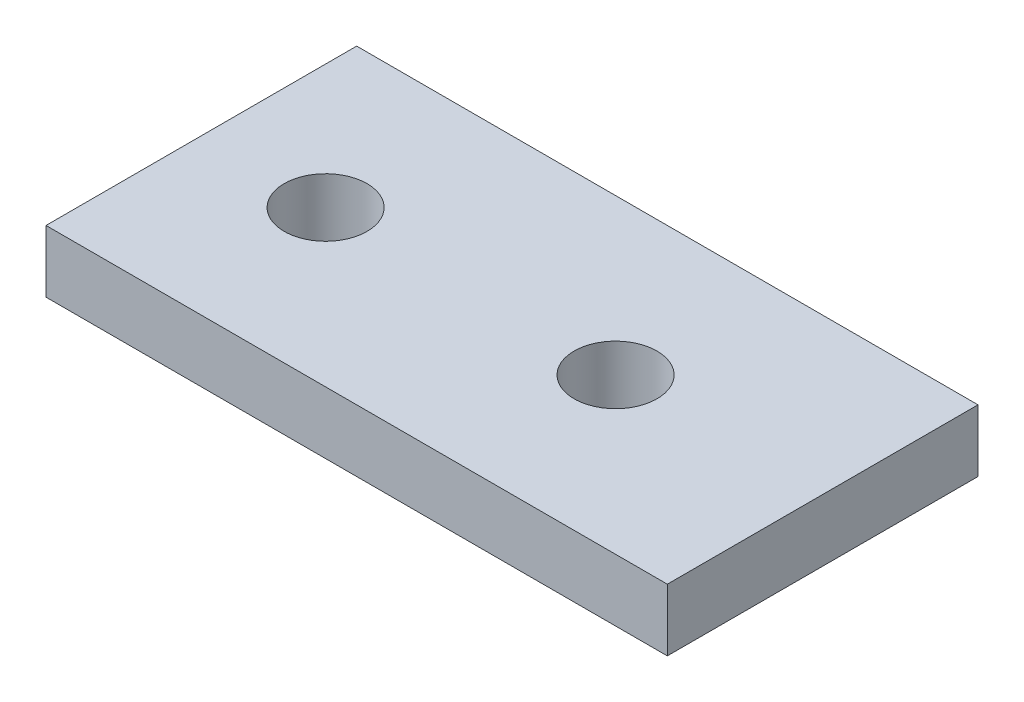
ISO-10303-21;
HEADER;
FILE_DESCRIPTION(('STEP AP214'),'2;1');
FILE_NAME('part.step','',(''),(''),'','','');
FILE_SCHEMA(('AUTOMOTIVE_DESIGN { 1 0 10303 214 1 1 1 1 }'));
ENDSEC;
DATA;
#1=APPLICATION_CONTEXT('core data for automotive mechanical design processes');
#2=APPLICATION_PROTOCOL_DEFINITION('international standard','automotive_design',2000,#1);
#3=PRODUCT_CONTEXT('',#1,'mechanical');
#4=PRODUCT('Part','Part','',(#3));
#5=PRODUCT_RELATED_PRODUCT_CATEGORY('part','',(#4));
#6=PRODUCT_DEFINITION_FORMATION('','',#4);
#7=PRODUCT_DEFINITION_CONTEXT('part definition',#1,'design');
#8=PRODUCT_DEFINITION('design','',#6,#7);
#9=PRODUCT_DEFINITION_SHAPE('','',#8);
#10=(LENGTH_UNIT() NAMED_UNIT(*) SI_UNIT(.MILLI.,.METRE.));
#11=(NAMED_UNIT(*) PLANE_ANGLE_UNIT() SI_UNIT($,.RADIAN.));
#12=(NAMED_UNIT(*) SI_UNIT($,.STERADIAN.) SOLID_ANGLE_UNIT());
#13=UNCERTAINTY_MEASURE_WITH_UNIT(LENGTH_MEASURE(1.E-05),#10,'distance_accuracy_value','');
#14=(GEOMETRIC_REPRESENTATION_CONTEXT(3) GLOBAL_UNCERTAINTY_ASSIGNED_CONTEXT((#13)) GLOBAL_UNIT_ASSIGNED_CONTEXT((#10,
#11,#12)) REPRESENTATION_CONTEXT('',''));
#15=CARTESIAN_POINT('',(0.,0.,0.));
#16=DIRECTION('',(0.,0.,1.));
#17=DIRECTION('',(1.,0.,0.));
#18=AXIS2_PLACEMENT_3D('',#15,#16,#17);
#19=CARTESIAN_POINT('',(-30.,5.99999999999991,-15.));
#20=DIRECTION('',(0.,1.,0.));
#21=DIRECTION('',(0.,0.,-1.));
#22=AXIS2_PLACEMENT_3D('',#19,#20,#21);
#23=PLANE('',#22);
#24=CARTESIAN_POINT('',(10.,6.00000000000009,0.));
#25=DIRECTION('',(0.,-1.,0.));
#26=DIRECTION('',(0.,0.,-1.));
#27=AXIS2_PLACEMENT_3D('',#24,#25,#26);
#28=CIRCLE('',#27,4.);
#29=CARTESIAN_POINT('',(10.,6.00000000000009,-4.));
#30=VERTEX_POINT('',#29);
#31=EDGE_CURVE('E103',#30,#30,#28,.T.);
#32=ORIENTED_EDGE('',*,*,#31,.T.);
#33=EDGE_LOOP('',(#32));
#34=FACE_BOUND('',#33,.T.);
#35=DIRECTION('',(0.,0.,-1.));
#36=VECTOR('',#35,1.);
#37=CARTESIAN_POINT('',(-30.,5.99999999999991,15.));
#38=LINE('',#37,#36);
#39=CARTESIAN_POINT('',(-30.,5.99999999999991,15.));
#40=VERTEX_POINT('',#39);
#41=CARTESIAN_POINT('',(-30.,5.99999999999991,-15.));
#42=VERTEX_POINT('',#41);
#43=EDGE_CURVE('E91',#40,#42,#38,.T.);
#44=ORIENTED_EDGE('',*,*,#43,.F.);
#45=DIRECTION('',(-1.,0.,0.));
#46=VECTOR('',#45,1.);
#47=CARTESIAN_POINT('',(-30.,5.99999999999991,15.));
#48=LINE('',#47,#46);
#49=CARTESIAN_POINT('',(30.,6.00000000000015,15.));
#50=VERTEX_POINT('',#49);
#51=EDGE_CURVE('E94',#50,#40,#48,.T.);
#52=ORIENTED_EDGE('',*,*,#51,.F.);
#53=DIRECTION('',(0.,0.,1.));
#54=VECTOR('',#53,1.);
#55=CARTESIAN_POINT('',(30.,6.00000000000015,15.));
#56=LINE('',#55,#54);
#57=CARTESIAN_POINT('',(30.,6.00000000000015,-15.));
#58=VERTEX_POINT('',#57);
#59=EDGE_CURVE('E82',#58,#50,#56,.T.);
#60=ORIENTED_EDGE('',*,*,#59,.F.);
#61=DIRECTION('',(1.,0.,0.));
#62=VECTOR('',#61,1.);
#63=CARTESIAN_POINT('',(-30.,5.99999999999991,-15.));
#64=LINE('',#63,#62);
#65=EDGE_CURVE('E87',#42,#58,#64,.T.);
#66=ORIENTED_EDGE('',*,*,#65,.F.);
#67=EDGE_LOOP('',(#44,#52,#60,#66));
#68=FACE_BOUND('',#67,.T.);
#69=CARTESIAN_POINT('',(-18.,5.99999999999994,0.));
#70=DIRECTION('',(0.,-1.,0.));
#71=DIRECTION('',(0.,0.,-1.));
#72=AXIS2_PLACEMENT_3D('',#69,#70,#71);
#73=CIRCLE('',#72,4.);
#74=CARTESIAN_POINT('',(-18.,5.99999999999994,-4.));
#75=VERTEX_POINT('',#74);
#76=EDGE_CURVE('E114',#75,#75,#73,.T.);
#77=ORIENTED_EDGE('',*,*,#76,.T.);
#78=EDGE_LOOP('',(#77));
#79=FACE_BOUND('',#78,.T.);
#80=ADVANCED_FACE('F35',(#34,#68,#79),#23,.T.);
#81=CARTESIAN_POINT('',(-30.,0.,-15.));
#82=DIRECTION('',(0.,1.,0.));
#83=DIRECTION('',(0.,0.,-1.));
#84=AXIS2_PLACEMENT_3D('',#81,#82,#83);
#85=PLANE('',#84);
#86=CARTESIAN_POINT('',(10.,0.,0.));
#87=DIRECTION('',(0.,-1.,0.));
#88=DIRECTION('',(0.,0.,-1.));
#89=AXIS2_PLACEMENT_3D('',#86,#87,#88);
#90=CIRCLE('',#89,4.);
#91=CARTESIAN_POINT('',(10.,0.,-4.));
#92=VERTEX_POINT('',#91);
#93=EDGE_CURVE('E111',#92,#92,#90,.T.);
#94=ORIENTED_EDGE('',*,*,#93,.F.);
#95=EDGE_LOOP('',(#94));
#96=FACE_BOUND('',#95,.T.);
#97=DIRECTION('',(0.,0.,-1.));
#98=VECTOR('',#97,1.);
#99=CARTESIAN_POINT('',(-30.,0.,15.));
#100=LINE('',#99,#98);
#101=CARTESIAN_POINT('',(-30.,0.,15.));
#102=VERTEX_POINT('',#101);
#103=CARTESIAN_POINT('',(-30.,0.,-15.));
#104=VERTEX_POINT('',#103);
#105=EDGE_CURVE('E99',#102,#104,#100,.T.);
#106=ORIENTED_EDGE('',*,*,#105,.T.);
#107=DIRECTION('',(1.,0.,0.));
#108=VECTOR('',#107,1.);
#109=CARTESIAN_POINT('',(-30.,0.,-15.));
#110=LINE('',#109,#108);
#111=CARTESIAN_POINT('',(30.,1.49186218934005E-13,-15.));
#112=VERTEX_POINT('',#111);
#113=EDGE_CURVE('E102',#104,#112,#110,.T.);
#114=ORIENTED_EDGE('',*,*,#113,.T.);
#115=DIRECTION('',(0.,0.,1.));
#116=VECTOR('',#115,1.);
#117=CARTESIAN_POINT('',(30.,1.49186218934005E-13,15.));
#118=LINE('',#117,#116);
#119=CARTESIAN_POINT('',(30.,1.49186218934005E-13,15.));
#120=VERTEX_POINT('',#119);
#121=EDGE_CURVE('E85',#112,#120,#118,.T.);
#122=ORIENTED_EDGE('',*,*,#121,.T.);
#123=DIRECTION('',(-1.,0.,0.));
#124=VECTOR('',#123,1.);
#125=CARTESIAN_POINT('',(-30.,0.,15.));
#126=LINE('',#125,#124);
#127=EDGE_CURVE('E106',#120,#102,#126,.T.);
#128=ORIENTED_EDGE('',*,*,#127,.T.);
#129=EDGE_LOOP('',(#106,#114,#122,#128));
#130=FACE_BOUND('',#129,.T.);
#131=CARTESIAN_POINT('',(-18.,0.,0.));
#132=DIRECTION('',(0.,-1.,0.));
#133=DIRECTION('',(0.,0.,-1.));
#134=AXIS2_PLACEMENT_3D('',#131,#132,#133);
#135=CIRCLE('',#134,4.);
#136=CARTESIAN_POINT('',(-18.,0.,-4.));
#137=VERTEX_POINT('',#136);
#138=EDGE_CURVE('E117',#137,#137,#135,.T.);
#139=ORIENTED_EDGE('',*,*,#138,.F.);
#140=EDGE_LOOP('',(#139));
#141=FACE_BOUND('',#140,.T.);
#142=ADVANCED_FACE('F130',(#96,#130,#141),#85,.F.);
#143=CARTESIAN_POINT('',(-30.,5.99999999999991,15.));
#144=DIRECTION('',(1.,0.,0.));
#145=DIRECTION('',(0.,0.,1.));
#146=AXIS2_PLACEMENT_3D('',#143,#144,#145);
#147=PLANE('',#146);
#148=ORIENTED_EDGE('',*,*,#105,.F.);
#149=DIRECTION('',(0.,-1.,0.));
#150=VECTOR('',#149,1.);
#151=CARTESIAN_POINT('',(-30.,5.99999999999991,15.));
#152=LINE('',#151,#150);
#153=EDGE_CURVE('E52',#40,#102,#152,.T.);
#154=ORIENTED_EDGE('',*,*,#153,.F.);
#155=ORIENTED_EDGE('',*,*,#43,.T.);
#156=DIRECTION('',(0.,-1.,0.));
#157=VECTOR('',#156,1.);
#158=CARTESIAN_POINT('',(-30.,5.99999999999991,-15.));
#159=LINE('',#158,#157);
#160=EDGE_CURVE('E11',#42,#104,#159,.T.);
#161=ORIENTED_EDGE('',*,*,#160,.T.);
#162=EDGE_LOOP('',(#148,#154,#155,#161));
#163=FACE_BOUND('',#162,.T.);
#164=ADVANCED_FACE('F37',(#163),#147,.F.);
#165=CARTESIAN_POINT('',(-30.,5.99999999999991,-15.));
#166=DIRECTION('',(0.,0.,1.));
#167=DIRECTION('',(-1.,0.,0.));
#168=AXIS2_PLACEMENT_3D('',#165,#166,#167);
#169=PLANE('',#168);
#170=ORIENTED_EDGE('',*,*,#113,.F.);
#171=ORIENTED_EDGE('',*,*,#160,.F.);
#172=ORIENTED_EDGE('',*,*,#65,.T.);
#173=DIRECTION('',(0.,-1.,0.));
#174=VECTOR('',#173,1.);
#175=CARTESIAN_POINT('',(30.,6.00000000000015,-15.));
#176=LINE('',#175,#174);
#177=EDGE_CURVE('E44',#58,#112,#176,.T.);
#178=ORIENTED_EDGE('',*,*,#177,.T.);
#179=EDGE_LOOP('',(#170,#171,#172,#178));
#180=FACE_BOUND('',#179,.T.);
#181=ADVANCED_FACE('F88',(#180),#169,.F.);
#182=CARTESIAN_POINT('',(30.,6.00000000000015,15.));
#183=DIRECTION('',(-1.,0.,0.));
#184=DIRECTION('',(0.,0.,-1.));
#185=AXIS2_PLACEMENT_3D('',#182,#183,#184);
#186=PLANE('',#185);
#187=ORIENTED_EDGE('',*,*,#121,.F.);
#188=ORIENTED_EDGE('',*,*,#177,.F.);
#189=ORIENTED_EDGE('',*,*,#59,.T.);
#190=DIRECTION('',(0.,-1.,0.));
#191=VECTOR('',#190,1.);
#192=CARTESIAN_POINT('',(30.,6.00000000000015,15.));
#193=LINE('',#192,#191);
#194=EDGE_CURVE('E68',#50,#120,#193,.T.);
#195=ORIENTED_EDGE('',*,*,#194,.T.);
#196=EDGE_LOOP('',(#187,#188,#189,#195));
#197=FACE_BOUND('',#196,.T.);
#198=ADVANCED_FACE('F80',(#197),#186,.F.);
#199=CARTESIAN_POINT('',(-30.,5.99999999999991,15.));
#200=DIRECTION('',(0.,0.,-1.));
#201=DIRECTION('',(1.,0.,0.));
#202=AXIS2_PLACEMENT_3D('',#199,#200,#201);
#203=PLANE('',#202);
#204=ORIENTED_EDGE('',*,*,#127,.F.);
#205=ORIENTED_EDGE('',*,*,#194,.F.);
#206=ORIENTED_EDGE('',*,*,#51,.T.);
#207=ORIENTED_EDGE('',*,*,#153,.T.);
#208=EDGE_LOOP('',(#204,#205,#206,#207));
#209=FACE_BOUND('',#208,.T.);
#210=ADVANCED_FACE('F143',(#209),#203,.F.);
#211=CARTESIAN_POINT('',(10.,6.00000000000009,0.));
#212=DIRECTION('',(0.,-1.,0.));
#213=DIRECTION('',(0.,0.,1.));
#214=AXIS2_PLACEMENT_3D('',#211,#212,#213);
#215=CYLINDRICAL_SURFACE('',#214,4.);
#216=ORIENTED_EDGE('',*,*,#31,.F.);
#217=EDGE_LOOP('',(#216));
#218=FACE_BOUND('',#217,.T.);
#219=ORIENTED_EDGE('',*,*,#93,.T.);
#220=EDGE_LOOP('',(#219));
#221=FACE_BOUND('',#220,.T.);
#222=ADVANCED_FACE('F126',(#218,#221),#215,.F.);
#223=CARTESIAN_POINT('',(-18.,5.99999999999994,0.));
#224=DIRECTION('',(0.,-1.,0.));
#225=DIRECTION('',(0.,0.,1.));
#226=AXIS2_PLACEMENT_3D('',#223,#224,#225);
#227=CYLINDRICAL_SURFACE('',#226,4.);
#228=ORIENTED_EDGE('',*,*,#76,.F.);
#229=EDGE_LOOP('',(#228));
#230=FACE_BOUND('',#229,.T.);
#231=ORIENTED_EDGE('',*,*,#138,.T.);
#232=EDGE_LOOP('',(#231));
#233=FACE_BOUND('',#232,.T.);
#234=ADVANCED_FACE('F123',(#230,#233),#227,.F.);
#235=CLOSED_SHELL('',(#80,#142,#164,#181,#198,#210,#222,#234));
#236=MANIFOLD_SOLID_BREP('B2',#235);
#237=ADVANCED_BREP_SHAPE_REPRESENTATION('',(#18,#236),#14);
#238=SHAPE_DEFINITION_REPRESENTATION(#9,#237);
ENDSEC;
END-ISO-10303-21;
